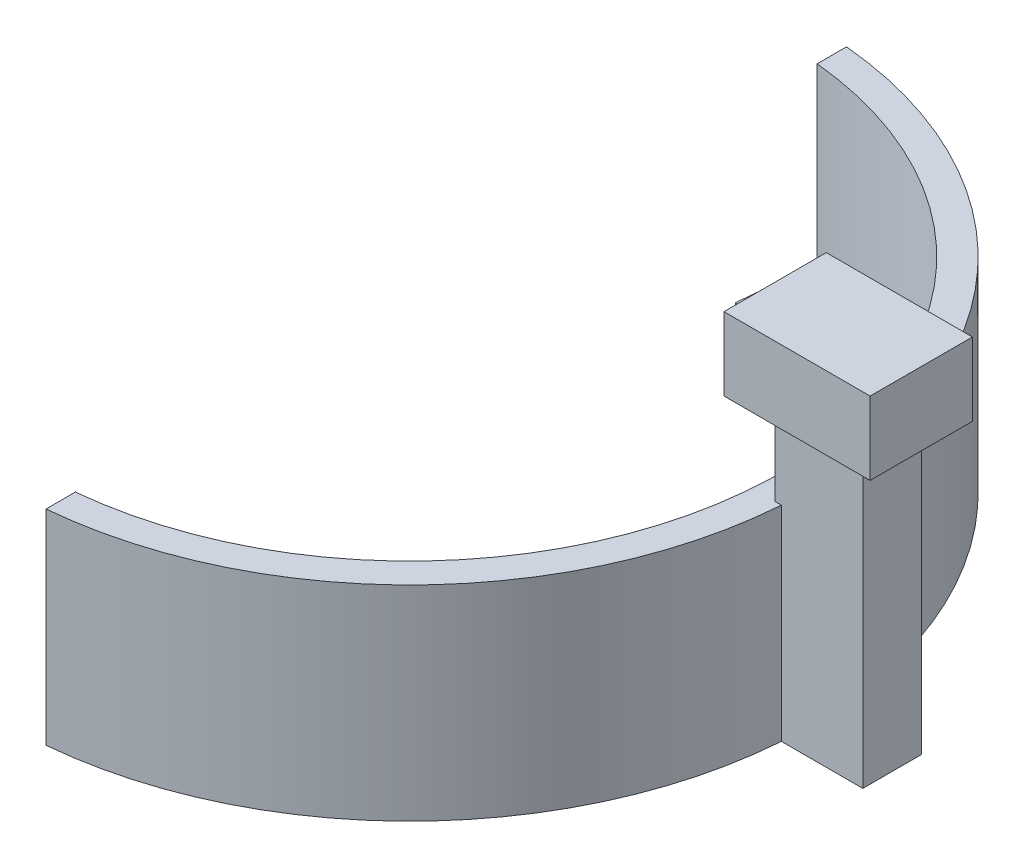
ISO-10303-21;
HEADER;
FILE_DESCRIPTION(('STEP AP214'),'2;1');
FILE_NAME('part.step','',(''),(''),'','','');
FILE_SCHEMA(('AUTOMOTIVE_DESIGN { 1 0 10303 214 1 1 1 1 }'));
ENDSEC;
DATA;
#1=APPLICATION_CONTEXT('core data for automotive mechanical design processes');
#2=APPLICATION_PROTOCOL_DEFINITION('international standard','automotive_design',2000,#1);
#3=PRODUCT_CONTEXT('',#1,'mechanical');
#4=PRODUCT('Part','Part','',(#3));
#5=PRODUCT_RELATED_PRODUCT_CATEGORY('part','',(#4));
#6=PRODUCT_DEFINITION_FORMATION('','',#4);
#7=PRODUCT_DEFINITION_CONTEXT('part definition',#1,'design');
#8=PRODUCT_DEFINITION('design','',#6,#7);
#9=PRODUCT_DEFINITION_SHAPE('','',#8);
#10=(LENGTH_UNIT() NAMED_UNIT(*) SI_UNIT(.MILLI.,.METRE.));
#11=(NAMED_UNIT(*) PLANE_ANGLE_UNIT() SI_UNIT($,.RADIAN.));
#12=(NAMED_UNIT(*) SI_UNIT($,.STERADIAN.) SOLID_ANGLE_UNIT());
#13=UNCERTAINTY_MEASURE_WITH_UNIT(LENGTH_MEASURE(1.E-05),#10,'distance_accuracy_value','');
#14=(GEOMETRIC_REPRESENTATION_CONTEXT(3) GLOBAL_UNCERTAINTY_ASSIGNED_CONTEXT((#13)) GLOBAL_UNIT_ASSIGNED_CONTEXT((#10,
#11,#12)) REPRESENTATION_CONTEXT('',''));
#15=CARTESIAN_POINT('',(0.,0.,0.));
#16=DIRECTION('',(0.,0.,1.));
#17=DIRECTION('',(1.,0.,0.));
#18=AXIS2_PLACEMENT_3D('',#15,#16,#17);
#19=CARTESIAN_POINT('',(0.,12.,0.));
#20=DIRECTION('',(0.,-1.,0.));
#21=DIRECTION('',(0.,0.,-1.));
#22=AXIS2_PLACEMENT_3D('',#19,#20,#21);
#23=CYLINDRICAL_SURFACE('',#22,27.5);
#24=DIRECTION('',(0.,-1.,0.));
#25=VECTOR('',#24,1.);
#26=CARTESIAN_POINT('',(27.427176303805,12.,-2.));
#27=LINE('',#26,#25);
#28=CARTESIAN_POINT('',(27.4271763038049,-2.,-2.));
#29=VERTEX_POINT('',#28);
#30=CARTESIAN_POINT('',(27.427176303805,12.,-2.));
#31=VERTEX_POINT('',#30);
#32=EDGE_CURVE('E176',#29,#31,#27,.F.);
#33=ORIENTED_EDGE('',*,*,#32,.F.);
#34=CARTESIAN_POINT('',(0.,-2.,0.));
#35=DIRECTION('',(0.,1.,0.));
#36=DIRECTION('',(0.,0.,-1.));
#37=AXIS2_PLACEMENT_3D('',#34,#35,#36);
#38=CIRCLE('',#37,27.5);
#39=CARTESIAN_POINT('',(2.5,-2.,-27.3861278752583));
#40=VERTEX_POINT('',#39);
#41=EDGE_CURVE('E167',#29,#40,#38,.T.);
#42=ORIENTED_EDGE('',*,*,#41,.T.);
#43=DIRECTION('',(0.,1.,0.));
#44=VECTOR('',#43,1.);
#45=CARTESIAN_POINT('',(2.5,-2.,-27.3861278752583));
#46=LINE('',#45,#44);
#47=CARTESIAN_POINT('',(2.5,0.,-27.3861278752583));
#48=VERTEX_POINT('',#47);
#49=EDGE_CURVE('E148',#40,#48,#46,.T.);
#50=ORIENTED_EDGE('',*,*,#49,.T.);
#51=DIRECTION('',(0.,-1.,0.));
#52=VECTOR('',#51,1.);
#53=CARTESIAN_POINT('',(2.5,12.,-27.3861278752583));
#54=LINE('',#53,#52);
#55=CARTESIAN_POINT('',(2.5,12.,-27.3861278752583));
#56=VERTEX_POINT('',#55);
#57=EDGE_CURVE('E11',#56,#48,#54,.T.);
#58=ORIENTED_EDGE('',*,*,#57,.F.);
#59=CARTESIAN_POINT('',(0.,12.,0.));
#60=DIRECTION('',(0.,1.,0.));
#61=DIRECTION('',(0.,0.,1.));
#62=AXIS2_PLACEMENT_3D('',#59,#60,#61);
#63=CIRCLE('',#62,27.5);
#64=EDGE_CURVE('E102',#31,#56,#63,.T.);
#65=ORIENTED_EDGE('',*,*,#64,.F.);
#66=EDGE_LOOP('',(#33,#42,#50,#58,#65));
#67=FACE_BOUND('',#66,.T.);
#68=ADVANCED_FACE('F39',(#67),#23,.T.);
#69=DIRECTION('',(0.,-1.,0.));
#70=VECTOR('',#69,1.);
#71=CARTESIAN_POINT('',(27.427176303805,12.,2.));
#72=LINE('',#71,#70);
#73=CARTESIAN_POINT('',(27.427176303805,12.,2.));
#74=VERTEX_POINT('',#73);
#75=CARTESIAN_POINT('',(27.4271763038049,-2.,2.));
#76=VERTEX_POINT('',#75);
#77=EDGE_CURVE('E143',#74,#76,#72,.T.);
#78=ORIENTED_EDGE('',*,*,#77,.F.);
#79=CARTESIAN_POINT('',(2.5,12.,27.3861278752583));
#80=VERTEX_POINT('',#79);
#81=EDGE_CURVE('E106',#80,#74,#63,.T.);
#82=ORIENTED_EDGE('',*,*,#81,.F.);
#83=DIRECTION('',(0.,-1.,0.));
#84=VECTOR('',#83,1.);
#85=CARTESIAN_POINT('',(2.5,12.,27.3861278752583));
#86=LINE('',#85,#84);
#87=CARTESIAN_POINT('',(2.5,0.,27.3861278752583));
#88=VERTEX_POINT('',#87);
#89=EDGE_CURVE('E119',#80,#88,#86,.T.);
#90=ORIENTED_EDGE('',*,*,#89,.T.);
#91=DIRECTION('',(0.,1.,0.));
#92=VECTOR('',#91,1.);
#93=CARTESIAN_POINT('',(2.5,-2.,27.3861278752583));
#94=LINE('',#93,#92);
#95=CARTESIAN_POINT('',(2.5,-2.,27.3861278752583));
#96=VERTEX_POINT('',#95);
#97=EDGE_CURVE('E125',#96,#88,#94,.T.);
#98=ORIENTED_EDGE('',*,*,#97,.F.);
#99=EDGE_CURVE('E188',#96,#76,#38,.T.);
#100=ORIENTED_EDGE('',*,*,#99,.T.);
#101=EDGE_LOOP('',(#78,#82,#90,#98,#100));
#102=FACE_BOUND('',#101,.T.);
#103=ADVANCED_FACE('F139',(#102),#23,.T.);
#104=CARTESIAN_POINT('',(0.,12.,0.));
#105=DIRECTION('',(0.,1.,0.));
#106=DIRECTION('',(0.,0.,1.));
#107=AXIS2_PLACEMENT_3D('',#104,#105,#106);
#108=PLANE('',#107);
#109=DIRECTION('',(0.,0.,-1.));
#110=VECTOR('',#109,1.);
#111=CARTESIAN_POINT('',(27.,12.,0.));
#112=LINE('',#111,#110);
#113=CARTESIAN_POINT('',(27.,12.,2.));
#114=VERTEX_POINT('',#113);
#115=CARTESIAN_POINT('',(27.,12.,-2.));
#116=VERTEX_POINT('',#115);
#117=EDGE_CURVE('E197',#114,#116,#112,.T.);
#118=ORIENTED_EDGE('',*,*,#117,.T.);
#119=DIRECTION('',(1.,0.,0.));
#120=VECTOR('',#119,1.);
#121=CARTESIAN_POINT('',(0.,12.,-2.));
#122=LINE('',#121,#120);
#123=EDGE_CURVE('E194',#116,#31,#122,.T.);
#124=ORIENTED_EDGE('',*,*,#123,.T.);
#125=ORIENTED_EDGE('',*,*,#64,.T.);
#126=DIRECTION('',(0.,0.,1.));
#127=VECTOR('',#126,1.);
#128=CARTESIAN_POINT('',(2.5,12.,-27.3861278752583));
#129=LINE('',#128,#127);
#130=CARTESIAN_POINT('',(2.5,12.,-25.377155080899));
#131=VERTEX_POINT('',#130);
#132=EDGE_CURVE('E93',#56,#131,#129,.T.);
#133=ORIENTED_EDGE('',*,*,#132,.T.);
#134=CARTESIAN_POINT('',(0.,12.,0.));
#135=DIRECTION('',(0.,-1.,0.));
#136=DIRECTION('',(0.,0.,1.));
#137=AXIS2_PLACEMENT_3D('',#134,#135,#136);
#138=CIRCLE('',#137,25.5);
#139=CARTESIAN_POINT('',(2.5,12.,25.377155080899));
#140=VERTEX_POINT('',#139);
#141=EDGE_CURVE('E98',#131,#140,#138,.T.);
#142=ORIENTED_EDGE('',*,*,#141,.T.);
#143=DIRECTION('',(0.,0.,1.));
#144=VECTOR('',#143,1.);
#145=CARTESIAN_POINT('',(2.5,12.,25.377155080899));
#146=LINE('',#145,#144);
#147=EDGE_CURVE('E63',#140,#80,#146,.T.);
#148=ORIENTED_EDGE('',*,*,#147,.T.);
#149=ORIENTED_EDGE('',*,*,#81,.T.);
#150=DIRECTION('',(-1.,0.,0.));
#151=VECTOR('',#150,1.);
#152=CARTESIAN_POINT('',(0.,12.,2.));
#153=LINE('',#152,#151);
#154=EDGE_CURVE('E202',#74,#114,#153,.T.);
#155=ORIENTED_EDGE('',*,*,#154,.T.);
#156=EDGE_LOOP('',(#118,#124,#125,#133,#142,#148,#149,#155));
#157=FACE_BOUND('',#156,.T.);
#158=ADVANCED_FACE('F96',(#157),#108,.T.);
#159=CARTESIAN_POINT('',(2.5,12.,-27.3861278752583));
#160=DIRECTION('',(1.,0.,0.));
#161=DIRECTION('',(0.,0.,-1.));
#162=AXIS2_PLACEMENT_3D('',#159,#160,#161);
#163=PLANE('',#162);
#164=DIRECTION('',(0.,0.,1.));
#165=VECTOR('',#164,1.);
#166=CARTESIAN_POINT('',(2.5,0.,-27.3861278752583));
#167=LINE('',#166,#165);
#168=CARTESIAN_POINT('',(2.5,0.,-25.377155080899));
#169=VERTEX_POINT('',#168);
#170=EDGE_CURVE('E110',#48,#169,#167,.T.);
#171=ORIENTED_EDGE('',*,*,#170,.T.);
#172=DIRECTION('',(0.,-1.,0.));
#173=VECTOR('',#172,1.);
#174=CARTESIAN_POINT('',(2.5,12.,-25.377155080899));
#175=LINE('',#174,#173);
#176=EDGE_CURVE('E47',#131,#169,#175,.T.);
#177=ORIENTED_EDGE('',*,*,#176,.F.);
#178=ORIENTED_EDGE('',*,*,#132,.F.);
#179=ORIENTED_EDGE('',*,*,#57,.T.);
#180=EDGE_LOOP('',(#171,#177,#178,#179));
#181=FACE_BOUND('',#180,.T.);
#182=ADVANCED_FACE('F109',(#181),#163,.F.);
#183=CARTESIAN_POINT('',(0.,12.,0.));
#184=DIRECTION('',(0.,-1.,0.));
#185=DIRECTION('',(0.,0.,-1.));
#186=AXIS2_PLACEMENT_3D('',#183,#184,#185);
#187=CYLINDRICAL_SURFACE('',#186,25.5);
#188=CARTESIAN_POINT('',(0.,0.,0.));
#189=DIRECTION('',(0.,-1.,0.));
#190=DIRECTION('',(0.,0.,1.));
#191=AXIS2_PLACEMENT_3D('',#188,#189,#190);
#192=CIRCLE('',#191,25.5);
#193=CARTESIAN_POINT('',(2.5,0.,25.377155080899));
#194=VERTEX_POINT('',#193);
#195=EDGE_CURVE('E76',#169,#194,#192,.T.);
#196=ORIENTED_EDGE('',*,*,#195,.T.);
#197=DIRECTION('',(0.,-1.,0.));
#198=VECTOR('',#197,1.);
#199=CARTESIAN_POINT('',(2.5,12.,25.377155080899));
#200=LINE('',#199,#198);
#201=EDGE_CURVE('E113',#140,#194,#200,.T.);
#202=ORIENTED_EDGE('',*,*,#201,.F.);
#203=ORIENTED_EDGE('',*,*,#141,.F.);
#204=ORIENTED_EDGE('',*,*,#176,.T.);
#205=EDGE_LOOP('',(#196,#202,#203,#204));
#206=FACE_BOUND('',#205,.T.);
#207=ADVANCED_FACE('F114',(#206),#187,.F.);
#208=CARTESIAN_POINT('',(2.5,12.,25.377155080899));
#209=DIRECTION('',(1.,0.,0.));
#210=DIRECTION('',(0.,0.,-1.));
#211=AXIS2_PLACEMENT_3D('',#208,#209,#210);
#212=PLANE('',#211);
#213=DIRECTION('',(0.,0.,1.));
#214=VECTOR('',#213,1.);
#215=CARTESIAN_POINT('',(2.5,0.,25.377155080899));
#216=LINE('',#215,#214);
#217=EDGE_CURVE('E84',#194,#88,#216,.T.);
#218=ORIENTED_EDGE('',*,*,#217,.T.);
#219=ORIENTED_EDGE('',*,*,#89,.F.);
#220=ORIENTED_EDGE('',*,*,#147,.F.);
#221=ORIENTED_EDGE('',*,*,#201,.T.);
#222=EDGE_LOOP('',(#218,#219,#220,#221));
#223=FACE_BOUND('',#222,.T.);
#224=ADVANCED_FACE('F135',(#223),#212,.F.);
#225=CARTESIAN_POINT('',(2.5,-2.,27.3861278752583));
#226=DIRECTION('',(-0.995859195463938,0.,0.0909090909090934));
#227=DIRECTION('',(0.0909090909090934,0.,0.995859195463938));
#228=AXIS2_PLACEMENT_3D('',#225,#226,#227);
#229=PLANE('',#228);
#230=DIRECTION('',(0.0909090909090934,0.,0.995859195463938));
#231=VECTOR('',#230,1.);
#232=CARTESIAN_POINT('',(2.5,0.,27.3861278752583));
#233=LINE('',#232,#231);
#234=CARTESIAN_POINT('',(1.86363636363634,0.,20.4151135070107));
#235=VERTEX_POINT('',#234);
#236=EDGE_CURVE('E164',#235,#88,#233,.T.);
#237=ORIENTED_EDGE('',*,*,#236,.F.);
#238=DIRECTION('',(0.,1.,0.));
#239=VECTOR('',#238,1.);
#240=CARTESIAN_POINT('',(1.86363636363634,-2.,20.4151135070107));
#241=LINE('',#240,#239);
#242=CARTESIAN_POINT('',(1.86363636363634,-2.,20.4151135070107));
#243=VERTEX_POINT('',#242);
#244=EDGE_CURVE('E157',#243,#235,#241,.T.);
#245=ORIENTED_EDGE('',*,*,#244,.F.);
#246=DIRECTION('',(0.0909090909090934,0.,0.995859195463938));
#247=VECTOR('',#246,1.);
#248=CARTESIAN_POINT('',(2.5,-2.,27.3861278752583));
#249=LINE('',#248,#247);
#250=EDGE_CURVE('E153',#243,#96,#249,.T.);
#251=ORIENTED_EDGE('',*,*,#250,.T.);
#252=ORIENTED_EDGE('',*,*,#97,.T.);
#253=EDGE_LOOP('',(#237,#245,#251,#252));
#254=FACE_BOUND('',#253,.T.);
#255=ADVANCED_FACE('F367',(#254),#229,.T.);
#256=CARTESIAN_POINT('',(0.,-2.,0.));
#257=DIRECTION('',(0.,1.,0.));
#258=DIRECTION('',(0.,0.,1.));
#259=AXIS2_PLACEMENT_3D('',#256,#257,#258);
#260=CYLINDRICAL_SURFACE('',#259,20.5);
#261=CARTESIAN_POINT('',(0.,0.,0.));
#262=DIRECTION('',(0.,-1.,0.));
#263=DIRECTION('',(0.,0.,-1.));
#264=AXIS2_PLACEMENT_3D('',#261,#262,#263);
#265=CIRCLE('',#264,20.5);
#266=CARTESIAN_POINT('',(1.86363636363636,0.,-20.4151135070107));
#267=VERTEX_POINT('',#266);
#268=EDGE_CURVE('E168',#267,#235,#265,.T.);
#269=ORIENTED_EDGE('',*,*,#268,.F.);
#270=DIRECTION('',(0.,1.,0.));
#271=VECTOR('',#270,1.);
#272=CARTESIAN_POINT('',(1.86363636363636,-2.,-20.4151135070107));
#273=LINE('',#272,#271);
#274=CARTESIAN_POINT('',(1.86363636363636,-2.,-20.4151135070107));
#275=VERTEX_POINT('',#274);
#276=EDGE_CURVE('E152',#275,#267,#273,.T.);
#277=ORIENTED_EDGE('',*,*,#276,.F.);
#278=CARTESIAN_POINT('',(0.,-2.,0.));
#279=DIRECTION('',(0.,-1.,0.));
#280=DIRECTION('',(0.,0.,-1.));
#281=AXIS2_PLACEMENT_3D('',#278,#279,#280);
#282=CIRCLE('',#281,20.5);
#283=EDGE_CURVE('E180',#275,#243,#282,.T.);
#284=ORIENTED_EDGE('',*,*,#283,.T.);
#285=ORIENTED_EDGE('',*,*,#244,.T.);
#286=EDGE_LOOP('',(#269,#277,#284,#285));
#287=FACE_BOUND('',#286,.T.);
#288=ADVANCED_FACE('F372',(#287),#260,.F.);
#289=CARTESIAN_POINT('',(2.5,-2.,-27.3861278752583));
#290=DIRECTION('',(-0.995859195463938,0.,-0.0909090909090919));
#291=DIRECTION('',(-0.0909090909090919,0.,0.995859195463938));
#292=AXIS2_PLACEMENT_3D('',#289,#290,#291);
#293=PLANE('',#292);
#294=DIRECTION('',(-0.0909090909090919,0.,0.995859195463938));
#295=VECTOR('',#294,1.);
#296=CARTESIAN_POINT('',(2.5,0.,-27.3861278752583));
#297=LINE('',#296,#295);
#298=EDGE_CURVE('E172',#48,#267,#297,.T.);
#299=ORIENTED_EDGE('',*,*,#298,.F.);
#300=ORIENTED_EDGE('',*,*,#49,.F.);
#301=DIRECTION('',(-0.0909090909090919,0.,0.995859195463938));
#302=VECTOR('',#301,1.);
#303=CARTESIAN_POINT('',(2.5,-2.,-27.3861278752583));
#304=LINE('',#303,#302);
#305=EDGE_CURVE('E184',#40,#275,#304,.T.);
#306=ORIENTED_EDGE('',*,*,#305,.T.);
#307=ORIENTED_EDGE('',*,*,#276,.T.);
#308=EDGE_LOOP('',(#299,#300,#306,#307));
#309=FACE_BOUND('',#308,.T.);
#310=ADVANCED_FACE('F380',(#309),#293,.T.);
#311=CARTESIAN_POINT('',(0.,-2.,0.));
#312=DIRECTION('',(0.,-1.,0.));
#313=DIRECTION('',(0.,0.,-1.));
#314=AXIS2_PLACEMENT_3D('',#311,#312,#313);
#315=PLANE('',#314);
#316=ORIENTED_EDGE('',*,*,#41,.F.);
#317=DIRECTION('',(-1.,0.,0.));
#318=VECTOR('',#317,1.);
#319=CARTESIAN_POINT('',(27.,-2.,-2.));
#320=LINE('',#319,#318);
#321=CARTESIAN_POINT('',(33.,-2.,-2.));
#322=VERTEX_POINT('',#321);
#323=EDGE_CURVE('E225',#322,#29,#320,.T.);
#324=ORIENTED_EDGE('',*,*,#323,.F.);
#325=DIRECTION('',(0.,0.,-1.));
#326=VECTOR('',#325,1.);
#327=CARTESIAN_POINT('',(33.,-2.,-2.));
#328=LINE('',#327,#326);
#329=CARTESIAN_POINT('',(33.,-2.,2.));
#330=VERTEX_POINT('',#329);
#331=EDGE_CURVE('E229',#330,#322,#328,.T.);
#332=ORIENTED_EDGE('',*,*,#331,.F.);
#333=DIRECTION('',(1.,0.,0.));
#334=VECTOR('',#333,1.);
#335=CARTESIAN_POINT('',(27.,-2.,2.));
#336=LINE('',#335,#334);
#337=EDGE_CURVE('E220',#76,#330,#336,.T.);
#338=ORIENTED_EDGE('',*,*,#337,.F.);
#339=ORIENTED_EDGE('',*,*,#99,.F.);
#340=ORIENTED_EDGE('',*,*,#250,.F.);
#341=ORIENTED_EDGE('',*,*,#283,.F.);
#342=ORIENTED_EDGE('',*,*,#305,.F.);
#343=EDGE_LOOP('',(#316,#324,#332,#338,#339,#340,#341,#342));
#344=FACE_BOUND('',#343,.T.);
#345=ADVANCED_FACE('F378',(#344),#315,.T.);
#346=CARTESIAN_POINT('',(0.,0.,0.));
#347=DIRECTION('',(0.,-1.,0.));
#348=DIRECTION('',(0.,0.,-1.));
#349=AXIS2_PLACEMENT_3D('',#346,#347,#348);
#350=PLANE('',#349);
#351=ORIENTED_EDGE('',*,*,#217,.F.);
#352=ORIENTED_EDGE('',*,*,#195,.F.);
#353=ORIENTED_EDGE('',*,*,#170,.F.);
#354=ORIENTED_EDGE('',*,*,#298,.T.);
#355=ORIENTED_EDGE('',*,*,#268,.T.);
#356=ORIENTED_EDGE('',*,*,#236,.T.);
#357=EDGE_LOOP('',(#351,#352,#353,#354,#355,#356));
#358=FACE_BOUND('',#357,.T.);
#359=ADVANCED_FACE('F370',(#358),#350,.F.);
#360=CARTESIAN_POINT('',(27.,18.,-2.));
#361=DIRECTION('',(0.,0.,1.));
#362=DIRECTION('',(1.,0.,0.));
#363=AXIS2_PLACEMENT_3D('',#360,#361,#362);
#364=PLANE('',#363);
#365=ORIENTED_EDGE('',*,*,#323,.T.);
#366=ORIENTED_EDGE('',*,*,#32,.T.);
#367=ORIENTED_EDGE('',*,*,#123,.F.);
#368=DIRECTION('',(0.,-1.,0.));
#369=VECTOR('',#368,1.);
#370=CARTESIAN_POINT('',(27.,18.,-2.));
#371=LINE('',#370,#369);
#372=CARTESIAN_POINT('',(27.,18.,-2.));
#373=VERTEX_POINT('',#372);
#374=EDGE_CURVE('E209',#373,#116,#371,.T.);
#375=ORIENTED_EDGE('',*,*,#374,.F.);
#376=DIRECTION('',(-1.,0.,0.));
#377=VECTOR('',#376,1.);
#378=CARTESIAN_POINT('',(27.,18.,-2.));
#379=LINE('',#378,#377);
#380=CARTESIAN_POINT('',(33.,18.,-2.));
#381=VERTEX_POINT('',#380);
#382=EDGE_CURVE('E241',#381,#373,#379,.T.);
#383=ORIENTED_EDGE('',*,*,#382,.F.);
#384=DIRECTION('',(0.,-1.,0.));
#385=VECTOR('',#384,1.);
#386=CARTESIAN_POINT('',(33.,18.,-2.));
#387=LINE('',#386,#385);
#388=EDGE_CURVE('E205',#381,#322,#387,.T.);
#389=ORIENTED_EDGE('',*,*,#388,.T.);
#390=EDGE_LOOP('',(#365,#366,#367,#375,#383,#389));
#391=FACE_BOUND('',#390,.T.);
#392=ADVANCED_FACE('F388',(#391),#364,.F.);
#393=CARTESIAN_POINT('',(27.,18.,2.));
#394=DIRECTION('',(0.,0.,-1.));
#395=DIRECTION('',(-1.,0.,0.));
#396=AXIS2_PLACEMENT_3D('',#393,#394,#395);
#397=PLANE('',#396);
#398=ORIENTED_EDGE('',*,*,#154,.F.);
#399=ORIENTED_EDGE('',*,*,#77,.T.);
#400=ORIENTED_EDGE('',*,*,#337,.T.);
#401=DIRECTION('',(0.,-1.,0.));
#402=VECTOR('',#401,1.);
#403=CARTESIAN_POINT('',(33.,18.,2.));
#404=LINE('',#403,#402);
#405=CARTESIAN_POINT('',(33.,18.,2.));
#406=VERTEX_POINT('',#405);
#407=EDGE_CURVE('E215',#406,#330,#404,.T.);
#408=ORIENTED_EDGE('',*,*,#407,.F.);
#409=DIRECTION('',(1.,0.,0.));
#410=VECTOR('',#409,1.);
#411=CARTESIAN_POINT('',(27.,18.,2.));
#412=LINE('',#411,#410);
#413=CARTESIAN_POINT('',(27.,18.,2.));
#414=VERTEX_POINT('',#413);
#415=EDGE_CURVE('E219',#414,#406,#412,.T.);
#416=ORIENTED_EDGE('',*,*,#415,.F.);
#417=DIRECTION('',(0.,-1.,0.));
#418=VECTOR('',#417,1.);
#419=CARTESIAN_POINT('',(27.,18.,2.));
#420=LINE('',#419,#418);
#421=EDGE_CURVE('E54',#414,#114,#420,.T.);
#422=ORIENTED_EDGE('',*,*,#421,.T.);
#423=EDGE_LOOP('',(#398,#399,#400,#408,#416,#422));
#424=FACE_BOUND('',#423,.T.);
#425=ADVANCED_FACE('F392',(#424),#397,.F.);
#426=CARTESIAN_POINT('',(33.,18.,-2.));
#427=DIRECTION('',(-1.,0.,0.));
#428=DIRECTION('',(0.,0.,1.));
#429=AXIS2_PLACEMENT_3D('',#426,#427,#428);
#430=PLANE('',#429);
#431=ORIENTED_EDGE('',*,*,#331,.T.);
#432=ORIENTED_EDGE('',*,*,#388,.F.);
#433=DIRECTION('',(0.,0.,-1.));
#434=VECTOR('',#433,1.);
#435=CARTESIAN_POINT('',(33.,18.,-2.));
#436=LINE('',#435,#434);
#437=EDGE_CURVE('E224',#406,#381,#436,.T.);
#438=ORIENTED_EDGE('',*,*,#437,.F.);
#439=ORIENTED_EDGE('',*,*,#407,.T.);
#440=EDGE_LOOP('',(#431,#432,#438,#439));
#441=FACE_BOUND('',#440,.T.);
#442=ADVANCED_FACE('F390',(#441),#430,.F.);
#443=CARTESIAN_POINT('',(27.,18.,-2.));
#444=DIRECTION('',(1.,0.,0.));
#445=DIRECTION('',(0.,0.,-1.));
#446=AXIS2_PLACEMENT_3D('',#443,#444,#445);
#447=PLANE('',#446);
#448=ORIENTED_EDGE('',*,*,#117,.F.);
#449=ORIENTED_EDGE('',*,*,#421,.F.);
#450=DIRECTION('',(0.,0.,1.));
#451=VECTOR('',#450,1.);
#452=CARTESIAN_POINT('',(27.,18.,-2.));
#453=LINE('',#452,#451);
#454=EDGE_CURVE('E237',#373,#414,#453,.T.);
#455=ORIENTED_EDGE('',*,*,#454,.F.);
#456=ORIENTED_EDGE('',*,*,#374,.T.);
#457=EDGE_LOOP('',(#448,#449,#455,#456));
#458=FACE_BOUND('',#457,.T.);
#459=ADVANCED_FACE('F397',(#458),#447,.F.);
#460=CARTESIAN_POINT('',(0.,18.,0.));
#461=DIRECTION('',(0.,1.,0.));
#462=DIRECTION('',(0.,0.,1.));
#463=AXIS2_PLACEMENT_3D('',#460,#461,#462);
#464=PLANE('',#463);
#465=DIRECTION('',(0.,0.,-1.));
#466=VECTOR('',#465,1.);
#467=CARTESIAN_POINT('',(35.,18.,-3.5));
#468=LINE('',#467,#466);
#469=CARTESIAN_POINT('',(35.,18.,3.5));
#470=VERTEX_POINT('',#469);
#471=CARTESIAN_POINT('',(35.,18.,-3.5));
#472=VERTEX_POINT('',#471);
#473=EDGE_CURVE('E277',#470,#472,#468,.T.);
#474=ORIENTED_EDGE('',*,*,#473,.F.);
#475=DIRECTION('',(1.,0.,0.));
#476=VECTOR('',#475,1.);
#477=CARTESIAN_POINT('',(25.,18.,3.5));
#478=LINE('',#477,#476);
#479=CARTESIAN_POINT('',(25.,18.,3.5));
#480=VERTEX_POINT('',#479);
#481=EDGE_CURVE('E264',#480,#470,#478,.T.);
#482=ORIENTED_EDGE('',*,*,#481,.F.);
#483=DIRECTION('',(0.,0.,1.));
#484=VECTOR('',#483,1.);
#485=CARTESIAN_POINT('',(25.,18.,-3.5));
#486=LINE('',#485,#484);
#487=CARTESIAN_POINT('',(25.,18.,-3.5));
#488=VERTEX_POINT('',#487);
#489=EDGE_CURVE('E269',#488,#480,#486,.T.);
#490=ORIENTED_EDGE('',*,*,#489,.F.);
#491=DIRECTION('',(-1.,0.,0.));
#492=VECTOR('',#491,1.);
#493=CARTESIAN_POINT('',(25.,18.,-3.5));
#494=LINE('',#493,#492);
#495=EDGE_CURVE('E273',#472,#488,#494,.T.);
#496=ORIENTED_EDGE('',*,*,#495,.F.);
#497=EDGE_LOOP('',(#474,#482,#490,#496));
#498=FACE_BOUND('',#497,.T.);
#499=ORIENTED_EDGE('',*,*,#415,.T.);
#500=ORIENTED_EDGE('',*,*,#437,.T.);
#501=ORIENTED_EDGE('',*,*,#382,.T.);
#502=ORIENTED_EDGE('',*,*,#454,.T.);
#503=EDGE_LOOP('',(#499,#500,#501,#502));
#504=FACE_BOUND('',#503,.T.);
#505=ADVANCED_FACE('F394',(#498,#504),#464,.F.);
#506=CARTESIAN_POINT('',(35.,23.,-3.5));
#507=DIRECTION('',(-1.,0.,0.));
#508=DIRECTION('',(0.,0.,1.));
#509=AXIS2_PLACEMENT_3D('',#506,#507,#508);
#510=PLANE('',#509);
#511=ORIENTED_EDGE('',*,*,#473,.T.);
#512=DIRECTION('',(0.,-1.,0.));
#513=VECTOR('',#512,1.);
#514=CARTESIAN_POINT('',(35.,23.,-3.5));
#515=LINE('',#514,#513);
#516=CARTESIAN_POINT('',(35.,23.,-3.5));
#517=VERTEX_POINT('',#516);
#518=EDGE_CURVE('E233',#517,#472,#515,.T.);
#519=ORIENTED_EDGE('',*,*,#518,.F.);
#520=DIRECTION('',(0.,0.,-1.));
#521=VECTOR('',#520,1.);
#522=CARTESIAN_POINT('',(35.,23.,-3.5));
#523=LINE('',#522,#521);
#524=CARTESIAN_POINT('',(35.,23.,3.5));
#525=VERTEX_POINT('',#524);
#526=EDGE_CURVE('E268',#525,#517,#523,.T.);
#527=ORIENTED_EDGE('',*,*,#526,.F.);
#528=DIRECTION('',(0.,-1.,0.));
#529=VECTOR('',#528,1.);
#530=CARTESIAN_POINT('',(35.,23.,3.5));
#531=LINE('',#530,#529);
#532=EDGE_CURVE('E259',#525,#470,#531,.T.);
#533=ORIENTED_EDGE('',*,*,#532,.T.);
#534=EDGE_LOOP('',(#511,#519,#527,#533));
#535=FACE_BOUND('',#534,.T.);
#536=ADVANCED_FACE('F308',(#535),#510,.F.);
#537=CARTESIAN_POINT('',(25.,23.,-3.5));
#538=DIRECTION('',(0.,0.,1.));
#539=DIRECTION('',(1.,0.,0.));
#540=AXIS2_PLACEMENT_3D('',#537,#538,#539);
#541=PLANE('',#540);
#542=ORIENTED_EDGE('',*,*,#495,.T.);
#543=DIRECTION('',(0.,-1.,0.));
#544=VECTOR('',#543,1.);
#545=CARTESIAN_POINT('',(25.,23.,-3.5));
#546=LINE('',#545,#544);
#547=CARTESIAN_POINT('',(25.,23.,-3.5));
#548=VERTEX_POINT('',#547);
#549=EDGE_CURVE('E251',#548,#488,#546,.T.);
#550=ORIENTED_EDGE('',*,*,#549,.F.);
#551=DIRECTION('',(-1.,0.,0.));
#552=VECTOR('',#551,1.);
#553=CARTESIAN_POINT('',(25.,23.,-3.5));
#554=LINE('',#553,#552);
#555=EDGE_CURVE('E288',#517,#548,#554,.T.);
#556=ORIENTED_EDGE('',*,*,#555,.F.);
#557=ORIENTED_EDGE('',*,*,#518,.T.);
#558=EDGE_LOOP('',(#542,#550,#556,#557));
#559=FACE_BOUND('',#558,.T.);
#560=ADVANCED_FACE('F312',(#559),#541,.F.);
#561=CARTESIAN_POINT('',(25.,23.,-3.5));
#562=DIRECTION('',(1.,0.,0.));
#563=DIRECTION('',(0.,0.,-1.));
#564=AXIS2_PLACEMENT_3D('',#561,#562,#563);
#565=PLANE('',#564);
#566=ORIENTED_EDGE('',*,*,#489,.T.);
#567=DIRECTION('',(0.,-1.,0.));
#568=VECTOR('',#567,1.);
#569=CARTESIAN_POINT('',(25.,23.,3.5));
#570=LINE('',#569,#568);
#571=CARTESIAN_POINT('',(25.,23.,3.5));
#572=VERTEX_POINT('',#571);
#573=EDGE_CURVE('E255',#572,#480,#570,.T.);
#574=ORIENTED_EDGE('',*,*,#573,.F.);
#575=DIRECTION('',(0.,0.,1.));
#576=VECTOR('',#575,1.);
#577=CARTESIAN_POINT('',(25.,23.,-3.5));
#578=LINE('',#577,#576);
#579=EDGE_CURVE('E284',#548,#572,#578,.T.);
#580=ORIENTED_EDGE('',*,*,#579,.F.);
#581=ORIENTED_EDGE('',*,*,#549,.T.);
#582=EDGE_LOOP('',(#566,#574,#580,#581));
#583=FACE_BOUND('',#582,.T.);
#584=ADVANCED_FACE('F501',(#583),#565,.F.);
#585=CARTESIAN_POINT('',(25.,23.,3.5));
#586=DIRECTION('',(0.,0.,-1.));
#587=DIRECTION('',(-1.,0.,0.));
#588=AXIS2_PLACEMENT_3D('',#585,#586,#587);
#589=PLANE('',#588);
#590=ORIENTED_EDGE('',*,*,#481,.T.);
#591=ORIENTED_EDGE('',*,*,#532,.F.);
#592=DIRECTION('',(1.,0.,0.));
#593=VECTOR('',#592,1.);
#594=CARTESIAN_POINT('',(25.,23.,3.5));
#595=LINE('',#594,#593);
#596=EDGE_CURVE('E263',#572,#525,#595,.T.);
#597=ORIENTED_EDGE('',*,*,#596,.F.);
#598=ORIENTED_EDGE('',*,*,#573,.T.);
#599=EDGE_LOOP('',(#590,#591,#597,#598));
#600=FACE_BOUND('',#599,.T.);
#601=ADVANCED_FACE('F508',(#600),#589,.F.);
#602=CARTESIAN_POINT('',(0.,23.,0.));
#603=DIRECTION('',(0.,1.,0.));
#604=DIRECTION('',(0.,0.,1.));
#605=AXIS2_PLACEMENT_3D('',#602,#603,#604);
#606=PLANE('',#605);
#607=ORIENTED_EDGE('',*,*,#526,.T.);
#608=ORIENTED_EDGE('',*,*,#555,.T.);
#609=ORIENTED_EDGE('',*,*,#579,.T.);
#610=ORIENTED_EDGE('',*,*,#596,.T.);
#611=EDGE_LOOP('',(#607,#608,#609,#610));
#612=FACE_BOUND('',#611,.T.);
#613=ADVANCED_FACE('F298',(#612),#606,.T.);
#614=CLOSED_SHELL('',(#68,#103,#158,#182,#207,#224,#255,#288,#310,#345,#359,#392,#425,#442,#459,
#505,#536,#560,#584,#601,#613));
#615=MANIFOLD_SOLID_BREP('B2',#614);
#616=ADVANCED_BREP_SHAPE_REPRESENTATION('',(#18,#615),#14);
#617=SHAPE_DEFINITION_REPRESENTATION(#9,#616);
ENDSEC;
END-ISO-10303-21;
